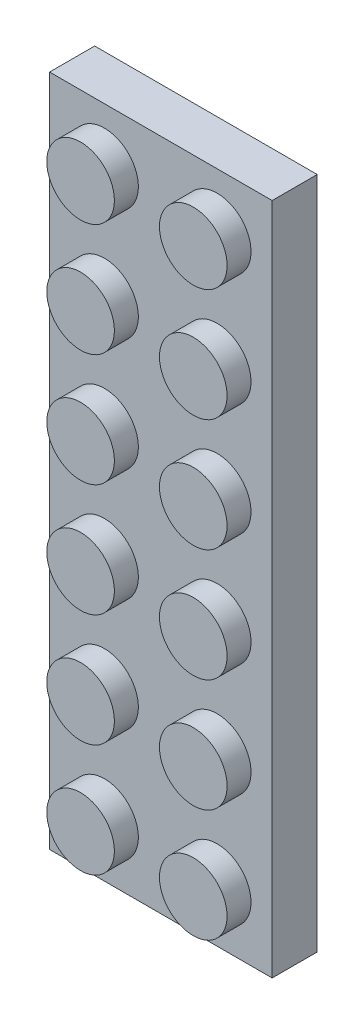
ISO-10303-21;
HEADER;
FILE_DESCRIPTION(('STEP AP214'),'2;1');
FILE_NAME('part.step','',(''),(''),'','','');
FILE_SCHEMA(('AUTOMOTIVE_DESIGN { 1 0 10303 214 1 1 1 1 }'));
ENDSEC;
DATA;
#1=APPLICATION_CONTEXT('core data for automotive mechanical design processes');
#2=APPLICATION_PROTOCOL_DEFINITION('international standard','automotive_design',2000,#1);
#3=PRODUCT_CONTEXT('',#1,'mechanical');
#4=PRODUCT('Part','Part','',(#3));
#5=PRODUCT_RELATED_PRODUCT_CATEGORY('part','',(#4));
#6=PRODUCT_DEFINITION_FORMATION('','',#4);
#7=PRODUCT_DEFINITION_CONTEXT('part definition',#1,'design');
#8=PRODUCT_DEFINITION('design','',#6,#7);
#9=PRODUCT_DEFINITION_SHAPE('','',#8);
#10=(LENGTH_UNIT() NAMED_UNIT(*) SI_UNIT(.MILLI.,.METRE.));
#11=(NAMED_UNIT(*) PLANE_ANGLE_UNIT() SI_UNIT($,.RADIAN.));
#12=(NAMED_UNIT(*) SI_UNIT($,.STERADIAN.) SOLID_ANGLE_UNIT());
#13=UNCERTAINTY_MEASURE_WITH_UNIT(LENGTH_MEASURE(1.E-05),#10,'distance_accuracy_value','');
#14=(GEOMETRIC_REPRESENTATION_CONTEXT(3) GLOBAL_UNCERTAINTY_ASSIGNED_CONTEXT((#13)) GLOBAL_UNIT_ASSIGNED_CONTEXT((#10,
#11,#12)) REPRESENTATION_CONTEXT('',''));
#15=CARTESIAN_POINT('',(0.,0.,0.));
#16=DIRECTION('',(0.,0.,1.));
#17=DIRECTION('',(1.,0.,0.));
#18=AXIS2_PLACEMENT_3D('',#15,#16,#17);
#19=CARTESIAN_POINT('',(0.,0.,3.2));
#20=DIRECTION('',(0.,0.,-1.));
#21=DIRECTION('',(-1.,0.,0.));
#22=AXIS2_PLACEMENT_3D('',#19,#20,#21);
#23=PLANE('',#22);
#24=CARTESIAN_POINT('',(-3.99999999999966,-12.,3.2));
#25=DIRECTION('',(0.,0.,-1.));
#26=DIRECTION('',(-1.,0.,0.));
#27=AXIS2_PLACEMENT_3D('',#24,#25,#26);
#28=CIRCLE('',#27,2.4);
#29=CARTESIAN_POINT('',(-6.39999999999966,-12.,3.2));
#30=VERTEX_POINT('',#29);
#31=EDGE_CURVE('E44',#30,#30,#28,.F.);
#32=ORIENTED_EDGE('',*,*,#31,.F.);
#33=EDGE_LOOP('',(#32));
#34=FACE_BOUND('',#33,.T.);
#35=CARTESIAN_POINT('',(-3.99999999999983,4.,3.2));
#36=DIRECTION('',(0.,0.,-1.));
#37=DIRECTION('',(-1.,0.,0.));
#38=AXIS2_PLACEMENT_3D('',#35,#36,#37);
#39=CIRCLE('',#38,2.4);
#40=CARTESIAN_POINT('',(-6.39999999999983,4.,3.2));
#41=VERTEX_POINT('',#40);
#42=EDGE_CURVE('E137',#41,#41,#39,.F.);
#43=ORIENTED_EDGE('',*,*,#42,.F.);
#44=EDGE_LOOP('',(#43));
#45=FACE_BOUND('',#44,.T.);
#46=CARTESIAN_POINT('',(4.00000000000042,-20.,3.2));
#47=DIRECTION('',(0.,0.,-1.));
#48=DIRECTION('',(-1.,0.,0.));
#49=AXIS2_PLACEMENT_3D('',#46,#47,#48);
#50=CIRCLE('',#49,2.4);
#51=CARTESIAN_POINT('',(1.60000000000042,-20.,3.2));
#52=VERTEX_POINT('',#51);
#53=EDGE_CURVE('E131',#52,#52,#50,.F.);
#54=ORIENTED_EDGE('',*,*,#53,.F.);
#55=EDGE_LOOP('',(#54));
#56=FACE_BOUND('',#55,.T.);
#57=CARTESIAN_POINT('',(4.00000000000025,-4.,3.2));
#58=DIRECTION('',(0.,0.,-1.));
#59=DIRECTION('',(-1.,0.,0.));
#60=AXIS2_PLACEMENT_3D('',#57,#58,#59);
#61=CIRCLE('',#60,2.4);
#62=CARTESIAN_POINT('',(1.60000000000025,-4.,3.2));
#63=VERTEX_POINT('',#62);
#64=EDGE_CURVE('E125',#63,#63,#61,.F.);
#65=ORIENTED_EDGE('',*,*,#64,.F.);
#66=EDGE_LOOP('',(#65));
#67=FACE_BOUND('',#66,.T.);
#68=CARTESIAN_POINT('',(4.00000000000009,12.,3.2));
#69=DIRECTION('',(0.,0.,-1.));
#70=DIRECTION('',(-1.,0.,0.));
#71=AXIS2_PLACEMENT_3D('',#68,#69,#70);
#72=CIRCLE('',#71,2.4);
#73=CARTESIAN_POINT('',(1.60000000000009,12.,3.2));
#74=VERTEX_POINT('',#73);
#75=EDGE_CURVE('E119',#74,#74,#72,.F.);
#76=ORIENTED_EDGE('',*,*,#75,.F.);
#77=EDGE_LOOP('',(#76));
#78=FACE_BOUND('',#77,.T.);
#79=CARTESIAN_POINT('',(-4.,20.,3.2));
#80=DIRECTION('',(0.,0.,-1.));
#81=DIRECTION('',(-1.,0.,0.));
#82=AXIS2_PLACEMENT_3D('',#79,#80,#81);
#83=CIRCLE('',#82,2.4);
#84=CARTESIAN_POINT('',(-6.4,20.,3.2));
#85=VERTEX_POINT('',#84);
#86=EDGE_CURVE('E113',#85,#85,#83,.F.);
#87=ORIENTED_EDGE('',*,*,#86,.F.);
#88=EDGE_LOOP('',(#87));
#89=FACE_BOUND('',#88,.T.);
#90=DIRECTION('',(0.,1.,0.));
#91=VECTOR('',#90,1.);
#92=CARTESIAN_POINT('',(7.9,-23.9,3.2));
#93=LINE('',#92,#91);
#94=CARTESIAN_POINT('',(7.9,-23.9,3.2));
#95=VERTEX_POINT('',#94);
#96=CARTESIAN_POINT('',(7.9,23.9,3.2));
#97=VERTEX_POINT('',#96);
#98=EDGE_CURVE('E88',#95,#97,#93,.T.);
#99=ORIENTED_EDGE('',*,*,#98,.T.);
#100=DIRECTION('',(-1.,0.,0.));
#101=VECTOR('',#100,1.);
#102=CARTESIAN_POINT('',(-7.9,23.9,3.2));
#103=LINE('',#102,#101);
#104=CARTESIAN_POINT('',(-7.9,23.9,3.2));
#105=VERTEX_POINT('',#104);
#106=EDGE_CURVE('E83',#97,#105,#103,.T.);
#107=ORIENTED_EDGE('',*,*,#106,.T.);
#108=DIRECTION('',(0.,-1.,0.));
#109=VECTOR('',#108,1.);
#110=CARTESIAN_POINT('',(-7.9,-23.9,3.2));
#111=LINE('',#110,#109);
#112=CARTESIAN_POINT('',(-7.9,-23.9,3.2));
#113=VERTEX_POINT('',#112);
#114=EDGE_CURVE('E86',#105,#113,#111,.T.);
#115=ORIENTED_EDGE('',*,*,#114,.T.);
#116=DIRECTION('',(1.,0.,0.));
#117=VECTOR('',#116,1.);
#118=CARTESIAN_POINT('',(-7.9,-23.9,3.2));
#119=LINE('',#118,#117);
#120=EDGE_CURVE('E52',#113,#95,#119,.T.);
#121=ORIENTED_EDGE('',*,*,#120,.T.);
#122=EDGE_LOOP('',(#99,#107,#115,#121));
#123=FACE_BOUND('',#122,.T.);
#124=CARTESIAN_POINT('',(4.,20.,3.2));
#125=DIRECTION('',(0.,0.,-1.));
#126=DIRECTION('',(-1.,0.,0.));
#127=AXIS2_PLACEMENT_3D('',#124,#125,#126);
#128=CIRCLE('',#127,2.4);
#129=CARTESIAN_POINT('',(1.6,20.,3.2));
#130=VERTEX_POINT('',#129);
#131=EDGE_CURVE('E116',#130,#130,#128,.F.);
#132=ORIENTED_EDGE('',*,*,#131,.F.);
#133=EDGE_LOOP('',(#132));
#134=FACE_BOUND('',#133,.T.);
#135=CARTESIAN_POINT('',(4.00000000000017,4.,3.2));
#136=DIRECTION('',(0.,0.,-1.));
#137=DIRECTION('',(-1.,0.,0.));
#138=AXIS2_PLACEMENT_3D('',#135,#136,#137);
#139=CIRCLE('',#138,2.4);
#140=CARTESIAN_POINT('',(1.60000000000017,4.,3.2));
#141=VERTEX_POINT('',#140);
#142=EDGE_CURVE('E122',#141,#141,#139,.F.);
#143=ORIENTED_EDGE('',*,*,#142,.F.);
#144=EDGE_LOOP('',(#143));
#145=FACE_BOUND('',#144,.T.);
#146=CARTESIAN_POINT('',(4.00000000000034,-12.,3.2));
#147=DIRECTION('',(0.,0.,-1.));
#148=DIRECTION('',(-1.,0.,0.));
#149=AXIS2_PLACEMENT_3D('',#146,#147,#148);
#150=CIRCLE('',#149,2.4);
#151=CARTESIAN_POINT('',(1.60000000000034,-12.,3.2));
#152=VERTEX_POINT('',#151);
#153=EDGE_CURVE('E128',#152,#152,#150,.F.);
#154=ORIENTED_EDGE('',*,*,#153,.F.);
#155=EDGE_LOOP('',(#154));
#156=FACE_BOUND('',#155,.T.);
#157=CARTESIAN_POINT('',(-3.99999999999991,12.,3.2));
#158=DIRECTION('',(0.,0.,-1.));
#159=DIRECTION('',(-1.,0.,0.));
#160=AXIS2_PLACEMENT_3D('',#157,#158,#159);
#161=CIRCLE('',#160,2.4);
#162=CARTESIAN_POINT('',(-6.39999999999991,12.,3.2));
#163=VERTEX_POINT('',#162);
#164=EDGE_CURVE('E134',#163,#163,#161,.F.);
#165=ORIENTED_EDGE('',*,*,#164,.F.);
#166=EDGE_LOOP('',(#165));
#167=FACE_BOUND('',#166,.T.);
#168=CARTESIAN_POINT('',(-3.99999999999975,-4.,3.2));
#169=DIRECTION('',(0.,0.,-1.));
#170=DIRECTION('',(-1.,0.,0.));
#171=AXIS2_PLACEMENT_3D('',#168,#169,#170);
#172=CIRCLE('',#171,2.4);
#173=CARTESIAN_POINT('',(-6.39999999999975,-4.,3.2));
#174=VERTEX_POINT('',#173);
#175=EDGE_CURVE('E140',#174,#174,#172,.F.);
#176=ORIENTED_EDGE('',*,*,#175,.F.);
#177=EDGE_LOOP('',(#176));
#178=FACE_BOUND('',#177,.T.);
#179=CARTESIAN_POINT('',(-3.99999999999958,-20.,3.2));
#180=DIRECTION('',(0.,0.,-1.));
#181=DIRECTION('',(-1.,0.,0.));
#182=AXIS2_PLACEMENT_3D('',#179,#180,#181);
#183=CIRCLE('',#182,2.4);
#184=CARTESIAN_POINT('',(-6.39999999999958,-20.,3.2));
#185=VERTEX_POINT('',#184);
#186=EDGE_CURVE('E11',#185,#185,#183,.F.);
#187=ORIENTED_EDGE('',*,*,#186,.F.);
#188=EDGE_LOOP('',(#187));
#189=FACE_BOUND('',#188,.T.);
#190=ADVANCED_FACE('F35',(#34,#45,#56,#67,#78,#89,#123,#134,#145,#156,#167,#178,#189),#23,.F.);
#191=CARTESIAN_POINT('',(7.9,-23.9,3.2));
#192=DIRECTION('',(-1.,0.,0.));
#193=DIRECTION('',(0.,0.,1.));
#194=AXIS2_PLACEMENT_3D('',#191,#192,#193);
#195=PLANE('',#194);
#196=DIRECTION('',(0.,1.,0.));
#197=VECTOR('',#196,1.);
#198=CARTESIAN_POINT('',(7.9,-23.9,0.));
#199=LINE('',#198,#197);
#200=CARTESIAN_POINT('',(7.9,-23.9,0.));
#201=VERTEX_POINT('',#200);
#202=CARTESIAN_POINT('',(7.9,23.9,0.));
#203=VERTEX_POINT('',#202);
#204=EDGE_CURVE('E103',#201,#203,#199,.T.);
#205=ORIENTED_EDGE('',*,*,#204,.T.);
#206=DIRECTION('',(0.,0.,-1.));
#207=VECTOR('',#206,1.);
#208=CARTESIAN_POINT('',(7.9,23.9,3.2));
#209=LINE('',#208,#207);
#210=EDGE_CURVE('E94',#97,#203,#209,.T.);
#211=ORIENTED_EDGE('',*,*,#210,.F.);
#212=ORIENTED_EDGE('',*,*,#98,.F.);
#213=DIRECTION('',(0.,0.,-1.));
#214=VECTOR('',#213,1.);
#215=CARTESIAN_POINT('',(7.9,-23.9,3.2));
#216=LINE('',#215,#214);
#217=EDGE_CURVE('E99',#95,#201,#216,.T.);
#218=ORIENTED_EDGE('',*,*,#217,.T.);
#219=EDGE_LOOP('',(#205,#211,#212,#218));
#220=FACE_BOUND('',#219,.T.);
#221=ADVANCED_FACE('F37',(#220),#195,.F.);
#222=CARTESIAN_POINT('',(-7.9,23.9,3.2));
#223=DIRECTION('',(0.,-1.,0.));
#224=DIRECTION('',(0.,0.,-1.));
#225=AXIS2_PLACEMENT_3D('',#222,#223,#224);
#226=PLANE('',#225);
#227=DIRECTION('',(-1.,0.,0.));
#228=VECTOR('',#227,1.);
#229=CARTESIAN_POINT('',(-7.9,23.9,0.));
#230=LINE('',#229,#228);
#231=CARTESIAN_POINT('',(-7.9,23.9,0.));
#232=VERTEX_POINT('',#231);
#233=EDGE_CURVE('E93',#203,#232,#230,.T.);
#234=ORIENTED_EDGE('',*,*,#233,.T.);
#235=DIRECTION('',(0.,0.,-1.));
#236=VECTOR('',#235,1.);
#237=CARTESIAN_POINT('',(-7.9,23.9,3.2));
#238=LINE('',#237,#236);
#239=EDGE_CURVE('E91',#105,#232,#238,.T.);
#240=ORIENTED_EDGE('',*,*,#239,.F.);
#241=ORIENTED_EDGE('',*,*,#106,.F.);
#242=ORIENTED_EDGE('',*,*,#210,.T.);
#243=EDGE_LOOP('',(#234,#240,#241,#242));
#244=FACE_BOUND('',#243,.T.);
#245=ADVANCED_FACE('F92',(#244),#226,.F.);
#246=CARTESIAN_POINT('',(-7.9,-23.9,3.2));
#247=DIRECTION('',(1.,0.,0.));
#248=DIRECTION('',(0.,0.,-1.));
#249=AXIS2_PLACEMENT_3D('',#246,#247,#248);
#250=PLANE('',#249);
#251=DIRECTION('',(0.,-1.,0.));
#252=VECTOR('',#251,1.);
#253=CARTESIAN_POINT('',(-7.9,-23.9,0.));
#254=LINE('',#253,#252);
#255=CARTESIAN_POINT('',(-7.9,-23.9,0.));
#256=VERTEX_POINT('',#255);
#257=EDGE_CURVE('E69',#232,#256,#254,.T.);
#258=ORIENTED_EDGE('',*,*,#257,.T.);
#259=DIRECTION('',(0.,0.,-1.));
#260=VECTOR('',#259,1.);
#261=CARTESIAN_POINT('',(-7.9,-23.9,3.2));
#262=LINE('',#261,#260);
#263=EDGE_CURVE('E95',#113,#256,#262,.T.);
#264=ORIENTED_EDGE('',*,*,#263,.F.);
#265=ORIENTED_EDGE('',*,*,#114,.F.);
#266=ORIENTED_EDGE('',*,*,#239,.T.);
#267=EDGE_LOOP('',(#258,#264,#265,#266));
#268=FACE_BOUND('',#267,.T.);
#269=ADVANCED_FACE('F97',(#268),#250,.F.);
#270=CARTESIAN_POINT('',(-7.9,-23.9,3.2));
#271=DIRECTION('',(0.,1.,0.));
#272=DIRECTION('',(0.,0.,1.));
#273=AXIS2_PLACEMENT_3D('',#270,#271,#272);
#274=PLANE('',#273);
#275=DIRECTION('',(1.,0.,0.));
#276=VECTOR('',#275,1.);
#277=CARTESIAN_POINT('',(-7.9,-23.9,0.));
#278=LINE('',#277,#276);
#279=EDGE_CURVE('E75',#256,#201,#278,.T.);
#280=ORIENTED_EDGE('',*,*,#279,.T.);
#281=ORIENTED_EDGE('',*,*,#217,.F.);
#282=ORIENTED_EDGE('',*,*,#120,.F.);
#283=ORIENTED_EDGE('',*,*,#263,.T.);
#284=EDGE_LOOP('',(#280,#281,#282,#283));
#285=FACE_BOUND('',#284,.T.);
#286=ADVANCED_FACE('F173',(#285),#274,.F.);
#287=CARTESIAN_POINT('',(0.,0.,0.));
#288=DIRECTION('',(0.,0.,-1.));
#289=DIRECTION('',(-1.,0.,0.));
#290=AXIS2_PLACEMENT_3D('',#287,#288,#289);
#291=PLANE('',#290);
#292=CARTESIAN_POINT('',(3.99999999999959,-20.,0.));
#293=DIRECTION('',(0.,0.,-1.));
#294=DIRECTION('',(-1.,0.,0.));
#295=AXIS2_PLACEMENT_3D('',#292,#293,#294);
#296=CIRCLE('',#295,2.5);
#297=CARTESIAN_POINT('',(1.49999999999959,-20.,0.));
#298=VERTEX_POINT('',#297);
#299=EDGE_CURVE('E294',#298,#298,#296,.T.);
#300=ORIENTED_EDGE('',*,*,#299,.F.);
#301=EDGE_LOOP('',(#300));
#302=FACE_BOUND('',#301,.T.);
#303=CARTESIAN_POINT('',(3.99999999999967,-12.,0.));
#304=DIRECTION('',(0.,0.,-1.));
#305=DIRECTION('',(-1.,0.,0.));
#306=AXIS2_PLACEMENT_3D('',#303,#304,#305);
#307=CIRCLE('',#306,2.5);
#308=CARTESIAN_POINT('',(1.49999999999967,-12.,0.));
#309=VERTEX_POINT('',#308);
#310=EDGE_CURVE('E288',#309,#309,#307,.T.);
#311=ORIENTED_EDGE('',*,*,#310,.F.);
#312=EDGE_LOOP('',(#311));
#313=FACE_BOUND('',#312,.T.);
#314=CARTESIAN_POINT('',(3.99999999999975,-4.,0.));
#315=DIRECTION('',(0.,0.,-1.));
#316=DIRECTION('',(-1.,0.,0.));
#317=AXIS2_PLACEMENT_3D('',#314,#315,#316);
#318=CIRCLE('',#317,2.5);
#319=CARTESIAN_POINT('',(1.49999999999975,-4.,0.));
#320=VERTEX_POINT('',#319);
#321=EDGE_CURVE('E282',#320,#320,#318,.T.);
#322=ORIENTED_EDGE('',*,*,#321,.F.);
#323=EDGE_LOOP('',(#322));
#324=FACE_BOUND('',#323,.T.);
#325=CARTESIAN_POINT('',(3.99999999999984,4.,0.));
#326=DIRECTION('',(0.,0.,-1.));
#327=DIRECTION('',(-1.,0.,0.));
#328=AXIS2_PLACEMENT_3D('',#325,#326,#327);
#329=CIRCLE('',#328,2.5);
#330=CARTESIAN_POINT('',(1.49999999999984,4.,0.));
#331=VERTEX_POINT('',#330);
#332=EDGE_CURVE('E276',#331,#331,#329,.T.);
#333=ORIENTED_EDGE('',*,*,#332,.F.);
#334=EDGE_LOOP('',(#333));
#335=FACE_BOUND('',#334,.T.);
#336=CARTESIAN_POINT('',(3.99999999999992,12.,0.));
#337=DIRECTION('',(0.,0.,-1.));
#338=DIRECTION('',(-1.,0.,0.));
#339=AXIS2_PLACEMENT_3D('',#336,#337,#338);
#340=CIRCLE('',#339,2.5);
#341=CARTESIAN_POINT('',(1.49999999999992,12.,0.));
#342=VERTEX_POINT('',#341);
#343=EDGE_CURVE('E270',#342,#342,#340,.T.);
#344=ORIENTED_EDGE('',*,*,#343,.F.);
#345=EDGE_LOOP('',(#344));
#346=FACE_BOUND('',#345,.T.);
#347=CARTESIAN_POINT('',(-4.00000000000042,-20.,0.));
#348=DIRECTION('',(0.,0.,-1.));
#349=DIRECTION('',(-1.,0.,0.));
#350=AXIS2_PLACEMENT_3D('',#347,#348,#349);
#351=CIRCLE('',#350,2.5);
#352=CARTESIAN_POINT('',(-6.50000000000041,-20.,0.));
#353=VERTEX_POINT('',#352);
#354=EDGE_CURVE('E264',#353,#353,#351,.T.);
#355=ORIENTED_EDGE('',*,*,#354,.F.);
#356=EDGE_LOOP('',(#355));
#357=FACE_BOUND('',#356,.T.);
#358=CARTESIAN_POINT('',(-4.00000000000033,-12.,0.));
#359=DIRECTION('',(0.,0.,-1.));
#360=DIRECTION('',(-1.,0.,0.));
#361=AXIS2_PLACEMENT_3D('',#358,#359,#360);
#362=CIRCLE('',#361,2.5);
#363=CARTESIAN_POINT('',(-6.50000000000033,-12.,0.));
#364=VERTEX_POINT('',#363);
#365=EDGE_CURVE('E258',#364,#364,#362,.T.);
#366=ORIENTED_EDGE('',*,*,#365,.F.);
#367=EDGE_LOOP('',(#366));
#368=FACE_BOUND('',#367,.T.);
#369=CARTESIAN_POINT('',(-4.00000000000025,-4.,0.));
#370=DIRECTION('',(0.,0.,-1.));
#371=DIRECTION('',(-1.,0.,0.));
#372=AXIS2_PLACEMENT_3D('',#369,#370,#371);
#373=CIRCLE('',#372,2.5);
#374=CARTESIAN_POINT('',(-6.50000000000025,-4.,0.));
#375=VERTEX_POINT('',#374);
#376=EDGE_CURVE('E252',#375,#375,#373,.T.);
#377=ORIENTED_EDGE('',*,*,#376,.F.);
#378=EDGE_LOOP('',(#377));
#379=FACE_BOUND('',#378,.T.);
#380=CARTESIAN_POINT('',(-4.00000000000016,4.,0.));
#381=DIRECTION('',(0.,0.,-1.));
#382=DIRECTION('',(-1.,0.,0.));
#383=AXIS2_PLACEMENT_3D('',#380,#381,#382);
#384=CIRCLE('',#383,2.5);
#385=CARTESIAN_POINT('',(-6.50000000000016,4.,0.));
#386=VERTEX_POINT('',#385);
#387=EDGE_CURVE('E246',#386,#386,#384,.T.);
#388=ORIENTED_EDGE('',*,*,#387,.F.);
#389=EDGE_LOOP('',(#388));
#390=FACE_BOUND('',#389,.T.);
#391=CARTESIAN_POINT('',(-4.00000000000008,12.,0.));
#392=DIRECTION('',(0.,0.,-1.));
#393=DIRECTION('',(-1.,0.,0.));
#394=AXIS2_PLACEMENT_3D('',#391,#392,#393);
#395=CIRCLE('',#394,2.5);
#396=CARTESIAN_POINT('',(-6.50000000000008,12.,0.));
#397=VERTEX_POINT('',#396);
#398=EDGE_CURVE('E240',#397,#397,#395,.T.);
#399=ORIENTED_EDGE('',*,*,#398,.F.);
#400=EDGE_LOOP('',(#399));
#401=FACE_BOUND('',#400,.T.);
#402=CARTESIAN_POINT('',(-4.,20.,0.));
#403=DIRECTION('',(0.,0.,-1.));
#404=DIRECTION('',(-1.,0.,0.));
#405=AXIS2_PLACEMENT_3D('',#402,#403,#404);
#406=CIRCLE('',#405,2.5);
#407=CARTESIAN_POINT('',(-6.5,20.,0.));
#408=VERTEX_POINT('',#407);
#409=EDGE_CURVE('E234',#408,#408,#406,.T.);
#410=ORIENTED_EDGE('',*,*,#409,.F.);
#411=EDGE_LOOP('',(#410));
#412=FACE_BOUND('',#411,.T.);
#413=CARTESIAN_POINT('',(4.,20.,0.));
#414=DIRECTION('',(0.,0.,-1.));
#415=DIRECTION('',(-1.,0.,0.));
#416=AXIS2_PLACEMENT_3D('',#413,#414,#415);
#417=CIRCLE('',#416,2.5);
#418=CARTESIAN_POINT('',(1.5,20.,0.));
#419=VERTEX_POINT('',#418);
#420=EDGE_CURVE('E228',#419,#419,#417,.T.);
#421=ORIENTED_EDGE('',*,*,#420,.F.);
#422=EDGE_LOOP('',(#421));
#423=FACE_BOUND('',#422,.T.);
#424=ORIENTED_EDGE('',*,*,#204,.F.);
#425=ORIENTED_EDGE('',*,*,#279,.F.);
#426=ORIENTED_EDGE('',*,*,#257,.F.);
#427=ORIENTED_EDGE('',*,*,#233,.F.);
#428=EDGE_LOOP('',(#424,#425,#426,#427));
#429=FACE_BOUND('',#428,.T.);
#430=ADVANCED_FACE('F163',(#302,#313,#324,#335,#346,#357,#368,#379,#390,#401,#412,#423,#429),
#291,.T.);
#431=CARTESIAN_POINT('',(-4.,20.,4.9));
#432=DIRECTION('',(0.,0.,-1.));
#433=DIRECTION('',(-1.,0.,0.));
#434=AXIS2_PLACEMENT_3D('',#431,#432,#433);
#435=CYLINDRICAL_SURFACE('',#434,2.4);
#436=CARTESIAN_POINT('',(-4.,20.,4.9));
#437=DIRECTION('',(0.,0.,1.));
#438=DIRECTION('',(1.,0.,0.));
#439=AXIS2_PLACEMENT_3D('',#436,#437,#438);
#440=CIRCLE('',#439,2.4);
#441=CARTESIAN_POINT('',(-1.6,20.,4.9));
#442=VERTEX_POINT('',#441);
#443=EDGE_CURVE('E106',#442,#442,#440,.T.);
#444=ORIENTED_EDGE('',*,*,#443,.F.);
#445=EDGE_LOOP('',(#444));
#446=FACE_BOUND('',#445,.T.);
#447=ORIENTED_EDGE('',*,*,#86,.T.);
#448=EDGE_LOOP('',(#447));
#449=FACE_BOUND('',#448,.T.);
#450=ADVANCED_FACE('F160',(#446,#449),#435,.T.);
#451=CARTESIAN_POINT('',(-4.,20.,4.9));
#452=DIRECTION('',(0.,0.,1.));
#453=DIRECTION('',(1.,0.,0.));
#454=AXIS2_PLACEMENT_3D('',#451,#452,#453);
#455=PLANE('',#454);
#456=ORIENTED_EDGE('',*,*,#443,.T.);
#457=EDGE_LOOP('',(#456));
#458=FACE_BOUND('',#457,.T.);
#459=ADVANCED_FACE('F162',(#458),#455,.T.);
#460=CARTESIAN_POINT('',(4.,20.,4.9));
#461=DIRECTION('',(0.,0.,-1.));
#462=DIRECTION('',(-1.,0.,0.));
#463=AXIS2_PLACEMENT_3D('',#460,#461,#462);
#464=CYLINDRICAL_SURFACE('',#463,2.4);
#465=CARTESIAN_POINT('',(4.,20.,4.9));
#466=DIRECTION('',(0.,0.,1.));
#467=DIRECTION('',(1.,0.,0.));
#468=AXIS2_PLACEMENT_3D('',#465,#466,#467);
#469=CIRCLE('',#468,2.4);
#470=CARTESIAN_POINT('',(6.4,20.,4.9));
#471=VERTEX_POINT('',#470);
#472=EDGE_CURVE('E194',#471,#471,#469,.T.);
#473=ORIENTED_EDGE('',*,*,#472,.F.);
#474=EDGE_LOOP('',(#473));
#475=FACE_BOUND('',#474,.T.);
#476=ORIENTED_EDGE('',*,*,#131,.T.);
#477=EDGE_LOOP('',(#476));
#478=FACE_BOUND('',#477,.T.);
#479=ADVANCED_FACE('F170',(#475,#478),#464,.T.);
#480=CARTESIAN_POINT('',(4.,20.,4.9));
#481=DIRECTION('',(0.,0.,1.));
#482=DIRECTION('',(1.,0.,0.));
#483=AXIS2_PLACEMENT_3D('',#480,#481,#482);
#484=PLANE('',#483);
#485=ORIENTED_EDGE('',*,*,#472,.T.);
#486=EDGE_LOOP('',(#485));
#487=FACE_BOUND('',#486,.T.);
#488=ADVANCED_FACE('F423',(#487),#484,.T.);
#489=CARTESIAN_POINT('',(4.00000000000009,12.,4.9));
#490=DIRECTION('',(0.,0.,-1.));
#491=DIRECTION('',(-1.,0.,0.));
#492=AXIS2_PLACEMENT_3D('',#489,#490,#491);
#493=CYLINDRICAL_SURFACE('',#492,2.4);
#494=CARTESIAN_POINT('',(4.00000000000009,12.,4.9));
#495=DIRECTION('',(0.,0.,1.));
#496=DIRECTION('',(1.,0.,0.));
#497=AXIS2_PLACEMENT_3D('',#494,#495,#496);
#498=CIRCLE('',#497,2.4);
#499=CARTESIAN_POINT('',(6.40000000000009,12.,4.9));
#500=VERTEX_POINT('',#499);
#501=EDGE_CURVE('E197',#500,#500,#498,.T.);
#502=ORIENTED_EDGE('',*,*,#501,.F.);
#503=EDGE_LOOP('',(#502));
#504=FACE_BOUND('',#503,.T.);
#505=ORIENTED_EDGE('',*,*,#75,.T.);
#506=EDGE_LOOP('',(#505));
#507=FACE_BOUND('',#506,.T.);
#508=ADVANCED_FACE('F419',(#504,#507),#493,.T.);
#509=CARTESIAN_POINT('',(4.00000000000009,12.,4.9));
#510=DIRECTION('',(0.,0.,1.));
#511=DIRECTION('',(1.,0.,0.));
#512=AXIS2_PLACEMENT_3D('',#509,#510,#511);
#513=PLANE('',#512);
#514=ORIENTED_EDGE('',*,*,#501,.T.);
#515=EDGE_LOOP('',(#514));
#516=FACE_BOUND('',#515,.T.);
#517=ADVANCED_FACE('F415',(#516),#513,.T.);
#518=CARTESIAN_POINT('',(4.00000000000017,4.,4.9));
#519=DIRECTION('',(0.,0.,-1.));
#520=DIRECTION('',(-1.,0.,0.));
#521=AXIS2_PLACEMENT_3D('',#518,#519,#520);
#522=CYLINDRICAL_SURFACE('',#521,2.4);
#523=CARTESIAN_POINT('',(4.00000000000017,4.,4.9));
#524=DIRECTION('',(0.,0.,1.));
#525=DIRECTION('',(1.,0.,0.));
#526=AXIS2_PLACEMENT_3D('',#523,#524,#525);
#527=CIRCLE('',#526,2.4);
#528=CARTESIAN_POINT('',(6.40000000000017,4.,4.9));
#529=VERTEX_POINT('',#528);
#530=EDGE_CURVE('E200',#529,#529,#527,.T.);
#531=ORIENTED_EDGE('',*,*,#530,.F.);
#532=EDGE_LOOP('',(#531));
#533=FACE_BOUND('',#532,.T.);
#534=ORIENTED_EDGE('',*,*,#142,.T.);
#535=EDGE_LOOP('',(#534));
#536=FACE_BOUND('',#535,.T.);
#537=ADVANCED_FACE('F411',(#533,#536),#522,.T.);
#538=CARTESIAN_POINT('',(4.00000000000017,4.,4.9));
#539=DIRECTION('',(0.,0.,1.));
#540=DIRECTION('',(1.,0.,0.));
#541=AXIS2_PLACEMENT_3D('',#538,#539,#540);
#542=PLANE('',#541);
#543=ORIENTED_EDGE('',*,*,#530,.T.);
#544=EDGE_LOOP('',(#543));
#545=FACE_BOUND('',#544,.T.);
#546=ADVANCED_FACE('F407',(#545),#542,.T.);
#547=CARTESIAN_POINT('',(4.00000000000025,-4.,4.9));
#548=DIRECTION('',(0.,0.,-1.));
#549=DIRECTION('',(-1.,0.,0.));
#550=AXIS2_PLACEMENT_3D('',#547,#548,#549);
#551=CYLINDRICAL_SURFACE('',#550,2.4);
#552=CARTESIAN_POINT('',(4.00000000000025,-4.,4.9));
#553=DIRECTION('',(0.,0.,1.));
#554=DIRECTION('',(1.,0.,0.));
#555=AXIS2_PLACEMENT_3D('',#552,#553,#554);
#556=CIRCLE('',#555,2.4);
#557=CARTESIAN_POINT('',(6.40000000000025,-4.,4.9));
#558=VERTEX_POINT('',#557);
#559=EDGE_CURVE('E203',#558,#558,#556,.T.);
#560=ORIENTED_EDGE('',*,*,#559,.F.);
#561=EDGE_LOOP('',(#560));
#562=FACE_BOUND('',#561,.T.);
#563=ORIENTED_EDGE('',*,*,#64,.T.);
#564=EDGE_LOOP('',(#563));
#565=FACE_BOUND('',#564,.T.);
#566=ADVANCED_FACE('F403',(#562,#565),#551,.T.);
#567=CARTESIAN_POINT('',(4.00000000000025,-4.,4.9));
#568=DIRECTION('',(0.,0.,1.));
#569=DIRECTION('',(1.,0.,0.));
#570=AXIS2_PLACEMENT_3D('',#567,#568,#569);
#571=PLANE('',#570);
#572=ORIENTED_EDGE('',*,*,#559,.T.);
#573=EDGE_LOOP('',(#572));
#574=FACE_BOUND('',#573,.T.);
#575=ADVANCED_FACE('F399',(#574),#571,.T.);
#576=CARTESIAN_POINT('',(4.00000000000034,-12.,4.9));
#577=DIRECTION('',(0.,0.,-1.));
#578=DIRECTION('',(-1.,0.,0.));
#579=AXIS2_PLACEMENT_3D('',#576,#577,#578);
#580=CYLINDRICAL_SURFACE('',#579,2.4);
#581=CARTESIAN_POINT('',(4.00000000000034,-12.,4.9));
#582=DIRECTION('',(0.,0.,1.));
#583=DIRECTION('',(1.,0.,0.));
#584=AXIS2_PLACEMENT_3D('',#581,#582,#583);
#585=CIRCLE('',#584,2.4);
#586=CARTESIAN_POINT('',(6.40000000000034,-12.,4.9));
#587=VERTEX_POINT('',#586);
#588=EDGE_CURVE('E206',#587,#587,#585,.T.);
#589=ORIENTED_EDGE('',*,*,#588,.F.);
#590=EDGE_LOOP('',(#589));
#591=FACE_BOUND('',#590,.T.);
#592=ORIENTED_EDGE('',*,*,#153,.T.);
#593=EDGE_LOOP('',(#592));
#594=FACE_BOUND('',#593,.T.);
#595=ADVANCED_FACE('F395',(#591,#594),#580,.T.);
#596=CARTESIAN_POINT('',(4.00000000000034,-12.,4.9));
#597=DIRECTION('',(0.,0.,1.));
#598=DIRECTION('',(1.,0.,0.));
#599=AXIS2_PLACEMENT_3D('',#596,#597,#598);
#600=PLANE('',#599);
#601=ORIENTED_EDGE('',*,*,#588,.T.);
#602=EDGE_LOOP('',(#601));
#603=FACE_BOUND('',#602,.T.);
#604=ADVANCED_FACE('F391',(#603),#600,.T.);
#605=CARTESIAN_POINT('',(4.00000000000042,-20.,4.9));
#606=DIRECTION('',(0.,0.,-1.));
#607=DIRECTION('',(-1.,0.,0.));
#608=AXIS2_PLACEMENT_3D('',#605,#606,#607);
#609=CYLINDRICAL_SURFACE('',#608,2.4);
#610=CARTESIAN_POINT('',(4.00000000000042,-20.,4.9));
#611=DIRECTION('',(0.,0.,1.));
#612=DIRECTION('',(1.,0.,0.));
#613=AXIS2_PLACEMENT_3D('',#610,#611,#612);
#614=CIRCLE('',#613,2.4);
#615=CARTESIAN_POINT('',(6.40000000000042,-20.,4.9));
#616=VERTEX_POINT('',#615);
#617=EDGE_CURVE('E209',#616,#616,#614,.T.);
#618=ORIENTED_EDGE('',*,*,#617,.F.);
#619=EDGE_LOOP('',(#618));
#620=FACE_BOUND('',#619,.T.);
#621=ORIENTED_EDGE('',*,*,#53,.T.);
#622=EDGE_LOOP('',(#621));
#623=FACE_BOUND('',#622,.T.);
#624=ADVANCED_FACE('F387',(#620,#623),#609,.T.);
#625=CARTESIAN_POINT('',(4.00000000000042,-20.,4.9));
#626=DIRECTION('',(0.,0.,1.));
#627=DIRECTION('',(1.,0.,0.));
#628=AXIS2_PLACEMENT_3D('',#625,#626,#627);
#629=PLANE('',#628);
#630=ORIENTED_EDGE('',*,*,#617,.T.);
#631=EDGE_LOOP('',(#630));
#632=FACE_BOUND('',#631,.T.);
#633=ADVANCED_FACE('F383',(#632),#629,.T.);
#634=CARTESIAN_POINT('',(-3.99999999999991,12.,4.9));
#635=DIRECTION('',(0.,0.,-1.));
#636=DIRECTION('',(-1.,0.,0.));
#637=AXIS2_PLACEMENT_3D('',#634,#635,#636);
#638=CYLINDRICAL_SURFACE('',#637,2.4);
#639=CARTESIAN_POINT('',(-3.99999999999991,12.,4.9));
#640=DIRECTION('',(0.,0.,1.));
#641=DIRECTION('',(1.,0.,0.));
#642=AXIS2_PLACEMENT_3D('',#639,#640,#641);
#643=CIRCLE('',#642,2.4);
#644=CARTESIAN_POINT('',(-1.59999999999991,12.,4.9));
#645=VERTEX_POINT('',#644);
#646=EDGE_CURVE('E212',#645,#645,#643,.T.);
#647=ORIENTED_EDGE('',*,*,#646,.F.);
#648=EDGE_LOOP('',(#647));
#649=FACE_BOUND('',#648,.T.);
#650=ORIENTED_EDGE('',*,*,#164,.T.);
#651=EDGE_LOOP('',(#650));
#652=FACE_BOUND('',#651,.T.);
#653=ADVANCED_FACE('F379',(#649,#652),#638,.T.);
#654=CARTESIAN_POINT('',(-3.99999999999991,12.,4.9));
#655=DIRECTION('',(0.,0.,1.));
#656=DIRECTION('',(1.,0.,0.));
#657=AXIS2_PLACEMENT_3D('',#654,#655,#656);
#658=PLANE('',#657);
#659=ORIENTED_EDGE('',*,*,#646,.T.);
#660=EDGE_LOOP('',(#659));
#661=FACE_BOUND('',#660,.T.);
#662=ADVANCED_FACE('F375',(#661),#658,.T.);
#663=CARTESIAN_POINT('',(-3.99999999999983,4.,4.9));
#664=DIRECTION('',(0.,0.,-1.));
#665=DIRECTION('',(-1.,0.,0.));
#666=AXIS2_PLACEMENT_3D('',#663,#664,#665);
#667=CYLINDRICAL_SURFACE('',#666,2.4);
#668=CARTESIAN_POINT('',(-3.99999999999983,4.,4.9));
#669=DIRECTION('',(0.,0.,1.));
#670=DIRECTION('',(1.,0.,0.));
#671=AXIS2_PLACEMENT_3D('',#668,#669,#670);
#672=CIRCLE('',#671,2.4);
#673=CARTESIAN_POINT('',(-1.59999999999983,4.,4.9));
#674=VERTEX_POINT('',#673);
#675=EDGE_CURVE('E215',#674,#674,#672,.T.);
#676=ORIENTED_EDGE('',*,*,#675,.F.);
#677=EDGE_LOOP('',(#676));
#678=FACE_BOUND('',#677,.T.);
#679=ORIENTED_EDGE('',*,*,#42,.T.);
#680=EDGE_LOOP('',(#679));
#681=FACE_BOUND('',#680,.T.);
#682=ADVANCED_FACE('F371',(#678,#681),#667,.T.);
#683=CARTESIAN_POINT('',(-3.99999999999983,4.,4.9));
#684=DIRECTION('',(0.,0.,1.));
#685=DIRECTION('',(1.,0.,0.));
#686=AXIS2_PLACEMENT_3D('',#683,#684,#685);
#687=PLANE('',#686);
#688=ORIENTED_EDGE('',*,*,#675,.T.);
#689=EDGE_LOOP('',(#688));
#690=FACE_BOUND('',#689,.T.);
#691=ADVANCED_FACE('F367',(#690),#687,.T.);
#692=CARTESIAN_POINT('',(-3.99999999999975,-4.,4.9));
#693=DIRECTION('',(0.,0.,-1.));
#694=DIRECTION('',(-1.,0.,0.));
#695=AXIS2_PLACEMENT_3D('',#692,#693,#694);
#696=CYLINDRICAL_SURFACE('',#695,2.4);
#697=CARTESIAN_POINT('',(-3.99999999999975,-4.,4.9));
#698=DIRECTION('',(0.,0.,1.));
#699=DIRECTION('',(1.,0.,0.));
#700=AXIS2_PLACEMENT_3D('',#697,#698,#699);
#701=CIRCLE('',#700,2.4);
#702=CARTESIAN_POINT('',(-1.59999999999975,-4.,4.9));
#703=VERTEX_POINT('',#702);
#704=EDGE_CURVE('E218',#703,#703,#701,.T.);
#705=ORIENTED_EDGE('',*,*,#704,.F.);
#706=EDGE_LOOP('',(#705));
#707=FACE_BOUND('',#706,.T.);
#708=ORIENTED_EDGE('',*,*,#175,.T.);
#709=EDGE_LOOP('',(#708));
#710=FACE_BOUND('',#709,.T.);
#711=ADVANCED_FACE('F363',(#707,#710),#696,.T.);
#712=CARTESIAN_POINT('',(-3.99999999999975,-4.,4.9));
#713=DIRECTION('',(0.,0.,1.));
#714=DIRECTION('',(1.,0.,0.));
#715=AXIS2_PLACEMENT_3D('',#712,#713,#714);
#716=PLANE('',#715);
#717=ORIENTED_EDGE('',*,*,#704,.T.);
#718=EDGE_LOOP('',(#717));
#719=FACE_BOUND('',#718,.T.);
#720=ADVANCED_FACE('F359',(#719),#716,.T.);
#721=CARTESIAN_POINT('',(-3.99999999999966,-12.,4.9));
#722=DIRECTION('',(0.,0.,-1.));
#723=DIRECTION('',(-1.,0.,0.));
#724=AXIS2_PLACEMENT_3D('',#721,#722,#723);
#725=CYLINDRICAL_SURFACE('',#724,2.4);
#726=CARTESIAN_POINT('',(-3.99999999999966,-12.,4.9));
#727=DIRECTION('',(0.,0.,1.));
#728=DIRECTION('',(1.,0.,0.));
#729=AXIS2_PLACEMENT_3D('',#726,#727,#728);
#730=CIRCLE('',#729,2.4);
#731=CARTESIAN_POINT('',(-1.59999999999966,-12.,4.9));
#732=VERTEX_POINT('',#731);
#733=EDGE_CURVE('E221',#732,#732,#730,.T.);
#734=ORIENTED_EDGE('',*,*,#733,.F.);
#735=EDGE_LOOP('',(#734));
#736=FACE_BOUND('',#735,.T.);
#737=ORIENTED_EDGE('',*,*,#31,.T.);
#738=EDGE_LOOP('',(#737));
#739=FACE_BOUND('',#738,.T.);
#740=ADVANCED_FACE('F145',(#736,#739),#725,.T.);
#741=CARTESIAN_POINT('',(-3.99999999999966,-12.,4.9));
#742=DIRECTION('',(0.,0.,1.));
#743=DIRECTION('',(1.,0.,0.));
#744=AXIS2_PLACEMENT_3D('',#741,#742,#743);
#745=PLANE('',#744);
#746=ORIENTED_EDGE('',*,*,#733,.T.);
#747=EDGE_LOOP('',(#746));
#748=FACE_BOUND('',#747,.T.);
#749=ADVANCED_FACE('F352',(#748),#745,.T.);
#750=CARTESIAN_POINT('',(-3.99999999999958,-20.,4.9));
#751=DIRECTION('',(0.,0.,-1.));
#752=DIRECTION('',(-1.,0.,0.));
#753=AXIS2_PLACEMENT_3D('',#750,#751,#752);
#754=CYLINDRICAL_SURFACE('',#753,2.4);
#755=CARTESIAN_POINT('',(-3.99999999999958,-20.,4.9));
#756=DIRECTION('',(0.,0.,1.));
#757=DIRECTION('',(1.,0.,0.));
#758=AXIS2_PLACEMENT_3D('',#755,#756,#757);
#759=CIRCLE('',#758,2.4);
#760=CARTESIAN_POINT('',(-1.59999999999958,-20.,4.9));
#761=VERTEX_POINT('',#760);
#762=EDGE_CURVE('E224',#761,#761,#759,.T.);
#763=ORIENTED_EDGE('',*,*,#762,.F.);
#764=EDGE_LOOP('',(#763));
#765=FACE_BOUND('',#764,.T.);
#766=ORIENTED_EDGE('',*,*,#186,.T.);
#767=EDGE_LOOP('',(#766));
#768=FACE_BOUND('',#767,.T.);
#769=ADVANCED_FACE('F344',(#765,#768),#754,.T.);
#770=CARTESIAN_POINT('',(-3.99999999999958,-20.,4.9));
#771=DIRECTION('',(0.,0.,1.));
#772=DIRECTION('',(1.,0.,0.));
#773=AXIS2_PLACEMENT_3D('',#770,#771,#772);
#774=PLANE('',#773);
#775=ORIENTED_EDGE('',*,*,#762,.T.);
#776=EDGE_LOOP('',(#775));
#777=FACE_BOUND('',#776,.T.);
#778=ADVANCED_FACE('F334',(#777),#774,.T.);
#779=CARTESIAN_POINT('',(4.,20.,1.8));
#780=DIRECTION('',(0.,0.,-1.));
#781=DIRECTION('',(-1.,0.,0.));
#782=AXIS2_PLACEMENT_3D('',#779,#780,#781);
#783=CYLINDRICAL_SURFACE('',#782,2.5);
#784=CARTESIAN_POINT('',(4.,20.,1.8));
#785=DIRECTION('',(0.,0.,-1.));
#786=DIRECTION('',(-1.,0.,0.));
#787=AXIS2_PLACEMENT_3D('',#784,#785,#786);
#788=CIRCLE('',#787,2.5);
#789=CARTESIAN_POINT('',(1.5,20.,1.8));
#790=VERTEX_POINT('',#789);
#791=EDGE_CURVE('E227',#790,#790,#788,.T.);
#792=ORIENTED_EDGE('',*,*,#791,.F.);
#793=EDGE_LOOP('',(#792));
#794=FACE_BOUND('',#793,.T.);
#795=ORIENTED_EDGE('',*,*,#420,.T.);
#796=EDGE_LOOP('',(#795));
#797=FACE_BOUND('',#796,.T.);
#798=ADVANCED_FACE('F331',(#794,#797),#783,.F.);
#799=CARTESIAN_POINT('',(4.,20.,1.8));
#800=DIRECTION('',(0.,0.,-1.));
#801=DIRECTION('',(-1.,0.,0.));
#802=AXIS2_PLACEMENT_3D('',#799,#800,#801);
#803=PLANE('',#802);
#804=ORIENTED_EDGE('',*,*,#791,.T.);
#805=EDGE_LOOP('',(#804));
#806=FACE_BOUND('',#805,.T.);
#807=ADVANCED_FACE('F333',(#806),#803,.T.);
#808=CARTESIAN_POINT('',(-4.,20.,1.8));
#809=DIRECTION('',(0.,0.,-1.));
#810=DIRECTION('',(-1.,0.,0.));
#811=AXIS2_PLACEMENT_3D('',#808,#809,#810);
#812=CYLINDRICAL_SURFACE('',#811,2.5);
#813=CARTESIAN_POINT('',(-4.,20.,1.8));
#814=DIRECTION('',(0.,0.,-1.));
#815=DIRECTION('',(-1.,0.,0.));
#816=AXIS2_PLACEMENT_3D('',#813,#814,#815);
#817=CIRCLE('',#816,2.5);
#818=CARTESIAN_POINT('',(-6.5,20.,1.8));
#819=VERTEX_POINT('',#818);
#820=EDGE_CURVE('E231',#819,#819,#817,.T.);
#821=ORIENTED_EDGE('',*,*,#820,.F.);
#822=EDGE_LOOP('',(#821));
#823=FACE_BOUND('',#822,.T.);
#824=ORIENTED_EDGE('',*,*,#409,.T.);
#825=EDGE_LOOP('',(#824));
#826=FACE_BOUND('',#825,.T.);
#827=ADVANCED_FACE('F341',(#823,#826),#812,.F.);
#828=CARTESIAN_POINT('',(-4.,20.,1.8));
#829=DIRECTION('',(0.,0.,-1.));
#830=DIRECTION('',(-1.,0.,0.));
#831=AXIS2_PLACEMENT_3D('',#828,#829,#830);
#832=PLANE('',#831);
#833=ORIENTED_EDGE('',*,*,#820,.T.);
#834=EDGE_LOOP('',(#833));
#835=FACE_BOUND('',#834,.T.);
#836=ADVANCED_FACE('F562',(#835),#832,.T.);
#837=CARTESIAN_POINT('',(-4.00000000000008,12.,1.8));
#838=DIRECTION('',(0.,0.,-1.));
#839=DIRECTION('',(-1.,0.,0.));
#840=AXIS2_PLACEMENT_3D('',#837,#838,#839);
#841=CYLINDRICAL_SURFACE('',#840,2.5);
#842=CARTESIAN_POINT('',(-4.00000000000008,12.,1.8));
#843=DIRECTION('',(0.,0.,-1.));
#844=DIRECTION('',(-1.,0.,0.));
#845=AXIS2_PLACEMENT_3D('',#842,#843,#844);
#846=CIRCLE('',#845,2.5);
#847=CARTESIAN_POINT('',(-6.50000000000008,12.,1.8));
#848=VERTEX_POINT('',#847);
#849=EDGE_CURVE('E237',#848,#848,#846,.T.);
#850=ORIENTED_EDGE('',*,*,#849,.F.);
#851=EDGE_LOOP('',(#850));
#852=FACE_BOUND('',#851,.T.);
#853=ORIENTED_EDGE('',*,*,#398,.T.);
#854=EDGE_LOOP('',(#853));
#855=FACE_BOUND('',#854,.T.);
#856=ADVANCED_FACE('F571',(#852,#855),#841,.F.);
#857=CARTESIAN_POINT('',(-4.00000000000008,12.,1.8));
#858=DIRECTION('',(0.,0.,-1.));
#859=DIRECTION('',(-1.,0.,0.));
#860=AXIS2_PLACEMENT_3D('',#857,#858,#859);
#861=PLANE('',#860);
#862=ORIENTED_EDGE('',*,*,#849,.T.);
#863=EDGE_LOOP('',(#862));
#864=FACE_BOUND('',#863,.T.);
#865=ADVANCED_FACE('F581',(#864),#861,.T.);
#866=CARTESIAN_POINT('',(-4.00000000000016,4.,1.8));
#867=DIRECTION('',(0.,0.,-1.));
#868=DIRECTION('',(-1.,0.,0.));
#869=AXIS2_PLACEMENT_3D('',#866,#867,#868);
#870=CYLINDRICAL_SURFACE('',#869,2.5);
#871=CARTESIAN_POINT('',(-4.00000000000016,4.,1.8));
#872=DIRECTION('',(0.,0.,-1.));
#873=DIRECTION('',(-1.,0.,0.));
#874=AXIS2_PLACEMENT_3D('',#871,#872,#873);
#875=CIRCLE('',#874,2.5);
#876=CARTESIAN_POINT('',(-6.50000000000016,4.,1.8));
#877=VERTEX_POINT('',#876);
#878=EDGE_CURVE('E243',#877,#877,#875,.T.);
#879=ORIENTED_EDGE('',*,*,#878,.F.);
#880=EDGE_LOOP('',(#879));
#881=FACE_BOUND('',#880,.T.);
#882=ORIENTED_EDGE('',*,*,#387,.T.);
#883=EDGE_LOOP('',(#882));
#884=FACE_BOUND('',#883,.T.);
#885=ADVANCED_FACE('F591',(#881,#884),#870,.F.);
#886=CARTESIAN_POINT('',(-4.00000000000016,4.,1.8));
#887=DIRECTION('',(0.,0.,-1.));
#888=DIRECTION('',(-1.,0.,0.));
#889=AXIS2_PLACEMENT_3D('',#886,#887,#888);
#890=PLANE('',#889);
#891=ORIENTED_EDGE('',*,*,#878,.T.);
#892=EDGE_LOOP('',(#891));
#893=FACE_BOUND('',#892,.T.);
#894=ADVANCED_FACE('F601',(#893),#890,.T.);
#895=CARTESIAN_POINT('',(-4.00000000000025,-4.,1.8));
#896=DIRECTION('',(0.,0.,-1.));
#897=DIRECTION('',(-1.,0.,0.));
#898=AXIS2_PLACEMENT_3D('',#895,#896,#897);
#899=CYLINDRICAL_SURFACE('',#898,2.5);
#900=CARTESIAN_POINT('',(-4.00000000000025,-4.,1.8));
#901=DIRECTION('',(0.,0.,-1.));
#902=DIRECTION('',(-1.,0.,0.));
#903=AXIS2_PLACEMENT_3D('',#900,#901,#902);
#904=CIRCLE('',#903,2.5);
#905=CARTESIAN_POINT('',(-6.50000000000025,-4.,1.8));
#906=VERTEX_POINT('',#905);
#907=EDGE_CURVE('E249',#906,#906,#904,.T.);
#908=ORIENTED_EDGE('',*,*,#907,.F.);
#909=EDGE_LOOP('',(#908));
#910=FACE_BOUND('',#909,.T.);
#911=ORIENTED_EDGE('',*,*,#376,.T.);
#912=EDGE_LOOP('',(#911));
#913=FACE_BOUND('',#912,.T.);
#914=ADVANCED_FACE('F611',(#910,#913),#899,.F.);
#915=CARTESIAN_POINT('',(-4.00000000000025,-4.,1.8));
#916=DIRECTION('',(0.,0.,-1.));
#917=DIRECTION('',(-1.,0.,0.));
#918=AXIS2_PLACEMENT_3D('',#915,#916,#917);
#919=PLANE('',#918);
#920=ORIENTED_EDGE('',*,*,#907,.T.);
#921=EDGE_LOOP('',(#920));
#922=FACE_BOUND('',#921,.T.);
#923=ADVANCED_FACE('F621',(#922),#919,.T.);
#924=CARTESIAN_POINT('',(-4.00000000000033,-12.,1.8));
#925=DIRECTION('',(0.,0.,-1.));
#926=DIRECTION('',(-1.,0.,0.));
#927=AXIS2_PLACEMENT_3D('',#924,#925,#926);
#928=CYLINDRICAL_SURFACE('',#927,2.5);
#929=CARTESIAN_POINT('',(-4.00000000000033,-12.,1.8));
#930=DIRECTION('',(0.,0.,-1.));
#931=DIRECTION('',(-1.,0.,0.));
#932=AXIS2_PLACEMENT_3D('',#929,#930,#931);
#933=CIRCLE('',#932,2.5);
#934=CARTESIAN_POINT('',(-6.50000000000033,-12.,1.8));
#935=VERTEX_POINT('',#934);
#936=EDGE_CURVE('E255',#935,#935,#933,.T.);
#937=ORIENTED_EDGE('',*,*,#936,.F.);
#938=EDGE_LOOP('',(#937));
#939=FACE_BOUND('',#938,.T.);
#940=ORIENTED_EDGE('',*,*,#365,.T.);
#941=EDGE_LOOP('',(#940));
#942=FACE_BOUND('',#941,.T.);
#943=ADVANCED_FACE('F631',(#939,#942),#928,.F.);
#944=CARTESIAN_POINT('',(-4.00000000000033,-12.,1.8));
#945=DIRECTION('',(0.,0.,-1.));
#946=DIRECTION('',(-1.,0.,0.));
#947=AXIS2_PLACEMENT_3D('',#944,#945,#946);
#948=PLANE('',#947);
#949=ORIENTED_EDGE('',*,*,#936,.T.);
#950=EDGE_LOOP('',(#949));
#951=FACE_BOUND('',#950,.T.);
#952=ADVANCED_FACE('F641',(#951),#948,.T.);
#953=CARTESIAN_POINT('',(-4.00000000000042,-20.,1.8));
#954=DIRECTION('',(0.,0.,-1.));
#955=DIRECTION('',(-1.,0.,0.));
#956=AXIS2_PLACEMENT_3D('',#953,#954,#955);
#957=CYLINDRICAL_SURFACE('',#956,2.5);
#958=CARTESIAN_POINT('',(-4.00000000000042,-20.,1.8));
#959=DIRECTION('',(0.,0.,-1.));
#960=DIRECTION('',(-1.,0.,0.));
#961=AXIS2_PLACEMENT_3D('',#958,#959,#960);
#962=CIRCLE('',#961,2.5);
#963=CARTESIAN_POINT('',(-6.50000000000041,-20.,1.8));
#964=VERTEX_POINT('',#963);
#965=EDGE_CURVE('E261',#964,#964,#962,.T.);
#966=ORIENTED_EDGE('',*,*,#965,.F.);
#967=EDGE_LOOP('',(#966));
#968=FACE_BOUND('',#967,.T.);
#969=ORIENTED_EDGE('',*,*,#354,.T.);
#970=EDGE_LOOP('',(#969));
#971=FACE_BOUND('',#970,.T.);
#972=ADVANCED_FACE('F651',(#968,#971),#957,.F.);
#973=CARTESIAN_POINT('',(-4.00000000000042,-20.,1.8));
#974=DIRECTION('',(0.,0.,-1.));
#975=DIRECTION('',(-1.,0.,0.));
#976=AXIS2_PLACEMENT_3D('',#973,#974,#975);
#977=PLANE('',#976);
#978=ORIENTED_EDGE('',*,*,#965,.T.);
#979=EDGE_LOOP('',(#978));
#980=FACE_BOUND('',#979,.T.);
#981=ADVANCED_FACE('F661',(#980),#977,.T.);
#982=CARTESIAN_POINT('',(3.99999999999992,12.,1.8));
#983=DIRECTION('',(0.,0.,-1.));
#984=DIRECTION('',(-1.,0.,0.));
#985=AXIS2_PLACEMENT_3D('',#982,#983,#984);
#986=CYLINDRICAL_SURFACE('',#985,2.5);
#987=CARTESIAN_POINT('',(3.99999999999992,12.,1.8));
#988=DIRECTION('',(0.,0.,-1.));
#989=DIRECTION('',(-1.,0.,0.));
#990=AXIS2_PLACEMENT_3D('',#987,#988,#989);
#991=CIRCLE('',#990,2.5);
#992=CARTESIAN_POINT('',(1.49999999999992,12.,1.8));
#993=VERTEX_POINT('',#992);
#994=EDGE_CURVE('E267',#993,#993,#991,.T.);
#995=ORIENTED_EDGE('',*,*,#994,.F.);
#996=EDGE_LOOP('',(#995));
#997=FACE_BOUND('',#996,.T.);
#998=ORIENTED_EDGE('',*,*,#343,.T.);
#999=EDGE_LOOP('',(#998));
#1000=FACE_BOUND('',#999,.T.);
#1001=ADVANCED_FACE('F671',(#997,#1000),#986,.F.);
#1002=CARTESIAN_POINT('',(3.99999999999992,12.,1.8));
#1003=DIRECTION('',(0.,0.,-1.));
#1004=DIRECTION('',(-1.,0.,0.));
#1005=AXIS2_PLACEMENT_3D('',#1002,#1003,#1004);
#1006=PLANE('',#1005);
#1007=ORIENTED_EDGE('',*,*,#994,.T.);
#1008=EDGE_LOOP('',(#1007));
#1009=FACE_BOUND('',#1008,.T.);
#1010=ADVANCED_FACE('F681',(#1009),#1006,.T.);
#1011=CARTESIAN_POINT('',(3.99999999999984,4.,1.8));
#1012=DIRECTION('',(0.,0.,-1.));
#1013=DIRECTION('',(-1.,0.,0.));
#1014=AXIS2_PLACEMENT_3D('',#1011,#1012,#1013);
#1015=CYLINDRICAL_SURFACE('',#1014,2.5);
#1016=CARTESIAN_POINT('',(3.99999999999984,4.,1.8));
#1017=DIRECTION('',(0.,0.,-1.));
#1018=DIRECTION('',(-1.,0.,0.));
#1019=AXIS2_PLACEMENT_3D('',#1016,#1017,#1018);
#1020=CIRCLE('',#1019,2.5);
#1021=CARTESIAN_POINT('',(1.49999999999984,4.,1.8));
#1022=VERTEX_POINT('',#1021);
#1023=EDGE_CURVE('E273',#1022,#1022,#1020,.T.);
#1024=ORIENTED_EDGE('',*,*,#1023,.F.);
#1025=EDGE_LOOP('',(#1024));
#1026=FACE_BOUND('',#1025,.T.);
#1027=ORIENTED_EDGE('',*,*,#332,.T.);
#1028=EDGE_LOOP('',(#1027));
#1029=FACE_BOUND('',#1028,.T.);
#1030=ADVANCED_FACE('F691',(#1026,#1029),#1015,.F.);
#1031=CARTESIAN_POINT('',(3.99999999999984,4.,1.8));
#1032=DIRECTION('',(0.,0.,-1.));
#1033=DIRECTION('',(-1.,0.,0.));
#1034=AXIS2_PLACEMENT_3D('',#1031,#1032,#1033);
#1035=PLANE('',#1034);
#1036=ORIENTED_EDGE('',*,*,#1023,.T.);
#1037=EDGE_LOOP('',(#1036));
#1038=FACE_BOUND('',#1037,.T.);
#1039=ADVANCED_FACE('F701',(#1038),#1035,.T.);
#1040=CARTESIAN_POINT('',(3.99999999999975,-4.,1.8));
#1041=DIRECTION('',(0.,0.,-1.));
#1042=DIRECTION('',(-1.,0.,0.));
#1043=AXIS2_PLACEMENT_3D('',#1040,#1041,#1042);
#1044=CYLINDRICAL_SURFACE('',#1043,2.5);
#1045=CARTESIAN_POINT('',(3.99999999999975,-4.,1.8));
#1046=DIRECTION('',(0.,0.,-1.));
#1047=DIRECTION('',(-1.,0.,0.));
#1048=AXIS2_PLACEMENT_3D('',#1045,#1046,#1047);
#1049=CIRCLE('',#1048,2.5);
#1050=CARTESIAN_POINT('',(1.49999999999975,-4.,1.8));
#1051=VERTEX_POINT('',#1050);
#1052=EDGE_CURVE('E279',#1051,#1051,#1049,.T.);
#1053=ORIENTED_EDGE('',*,*,#1052,.F.);
#1054=EDGE_LOOP('',(#1053));
#1055=FACE_BOUND('',#1054,.T.);
#1056=ORIENTED_EDGE('',*,*,#321,.T.);
#1057=EDGE_LOOP('',(#1056));
#1058=FACE_BOUND('',#1057,.T.);
#1059=ADVANCED_FACE('F711',(#1055,#1058),#1044,.F.);
#1060=CARTESIAN_POINT('',(3.99999999999975,-4.,1.8));
#1061=DIRECTION('',(0.,0.,-1.));
#1062=DIRECTION('',(-1.,0.,0.));
#1063=AXIS2_PLACEMENT_3D('',#1060,#1061,#1062);
#1064=PLANE('',#1063);
#1065=ORIENTED_EDGE('',*,*,#1052,.T.);
#1066=EDGE_LOOP('',(#1065));
#1067=FACE_BOUND('',#1066,.T.);
#1068=ADVANCED_FACE('F721',(#1067),#1064,.T.);
#1069=CARTESIAN_POINT('',(3.99999999999967,-12.,1.8));
#1070=DIRECTION('',(0.,0.,-1.));
#1071=DIRECTION('',(-1.,0.,0.));
#1072=AXIS2_PLACEMENT_3D('',#1069,#1070,#1071);
#1073=CYLINDRICAL_SURFACE('',#1072,2.5);
#1074=CARTESIAN_POINT('',(3.99999999999967,-12.,1.8));
#1075=DIRECTION('',(0.,0.,-1.));
#1076=DIRECTION('',(-1.,0.,0.));
#1077=AXIS2_PLACEMENT_3D('',#1074,#1075,#1076);
#1078=CIRCLE('',#1077,2.5);
#1079=CARTESIAN_POINT('',(1.49999999999967,-12.,1.8));
#1080=VERTEX_POINT('',#1079);
#1081=EDGE_CURVE('E285',#1080,#1080,#1078,.T.);
#1082=ORIENTED_EDGE('',*,*,#1081,.F.);
#1083=EDGE_LOOP('',(#1082));
#1084=FACE_BOUND('',#1083,.T.);
#1085=ORIENTED_EDGE('',*,*,#310,.T.);
#1086=EDGE_LOOP('',(#1085));
#1087=FACE_BOUND('',#1086,.T.);
#1088=ADVANCED_FACE('F731',(#1084,#1087),#1073,.F.);
#1089=CARTESIAN_POINT('',(3.99999999999967,-12.,1.8));
#1090=DIRECTION('',(0.,0.,-1.));
#1091=DIRECTION('',(-1.,0.,0.));
#1092=AXIS2_PLACEMENT_3D('',#1089,#1090,#1091);
#1093=PLANE('',#1092);
#1094=ORIENTED_EDGE('',*,*,#1081,.T.);
#1095=EDGE_LOOP('',(#1094));
#1096=FACE_BOUND('',#1095,.T.);
#1097=ADVANCED_FACE('F305',(#1096),#1093,.T.);
#1098=CARTESIAN_POINT('',(3.99999999999959,-20.,1.8));
#1099=DIRECTION('',(0.,0.,-1.));
#1100=DIRECTION('',(-1.,0.,0.));
#1101=AXIS2_PLACEMENT_3D('',#1098,#1099,#1100);
#1102=CYLINDRICAL_SURFACE('',#1101,2.5);
#1103=CARTESIAN_POINT('',(3.99999999999959,-20.,1.8));
#1104=DIRECTION('',(0.,0.,-1.));
#1105=DIRECTION('',(-1.,0.,0.));
#1106=AXIS2_PLACEMENT_3D('',#1103,#1104,#1105);
#1107=CIRCLE('',#1106,2.5);
#1108=CARTESIAN_POINT('',(1.49999999999959,-20.,1.8));
#1109=VERTEX_POINT('',#1108);
#1110=EDGE_CURVE('E291',#1109,#1109,#1107,.T.);
#1111=ORIENTED_EDGE('',*,*,#1110,.F.);
#1112=EDGE_LOOP('',(#1111));
#1113=FACE_BOUND('',#1112,.T.);
#1114=ORIENTED_EDGE('',*,*,#299,.T.);
#1115=EDGE_LOOP('',(#1114));
#1116=FACE_BOUND('',#1115,.T.);
#1117=ADVANCED_FACE('F302',(#1113,#1116),#1102,.F.);
#1118=CARTESIAN_POINT('',(3.99999999999959,-20.,1.8));
#1119=DIRECTION('',(0.,0.,-1.));
#1120=DIRECTION('',(-1.,0.,0.));
#1121=AXIS2_PLACEMENT_3D('',#1118,#1119,#1120);
#1122=PLANE('',#1121);
#1123=ORIENTED_EDGE('',*,*,#1110,.T.);
#1124=EDGE_LOOP('',(#1123));
#1125=FACE_BOUND('',#1124,.T.);
#1126=ADVANCED_FACE('F300',(#1125),#1122,.T.);
#1127=CLOSED_SHELL('',(#190,#221,#245,#269,#286,#430,#450,#459,#479,#488,#508,#517,#537,#546,
#566,#575,#595,#604,#624,#633,#653,#662,#682,#691,#711,#720,#740,#749,#769,#778,#798,#807,#827,
#836,#856,#865,#885,#894,#914,#923,#943,#952,#972,#981,#1001,#1010,#1030,#1039,#1059,#1068,
#1088,#1097,#1117,#1126));
#1128=MANIFOLD_SOLID_BREP('B2',#1127);
#1129=ADVANCED_BREP_SHAPE_REPRESENTATION('',(#18,#1128),#14);
#1130=SHAPE_DEFINITION_REPRESENTATION(#9,#1129);
ENDSEC;
END-ISO-10303-21;
